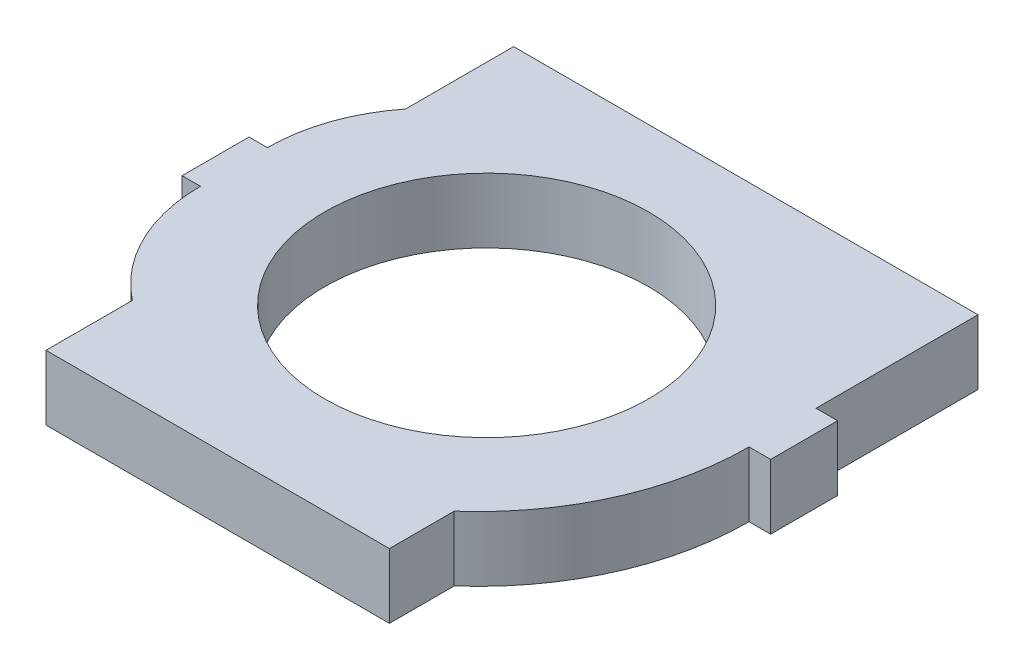
ISO-10303-21;
HEADER;
FILE_DESCRIPTION(('STEP AP214'),'2;1');
FILE_NAME('part.step','',(''),(''),'','','');
FILE_SCHEMA(('AUTOMOTIVE_DESIGN { 1 0 10303 214 1 1 1 1 }'));
ENDSEC;
DATA;
#1=APPLICATION_CONTEXT('core data for automotive mechanical design processes');
#2=APPLICATION_PROTOCOL_DEFINITION('international standard','automotive_design',2000,#1);
#3=PRODUCT_CONTEXT('',#1,'mechanical');
#4=PRODUCT('Part','Part','',(#3));
#5=PRODUCT_RELATED_PRODUCT_CATEGORY('part','',(#4));
#6=PRODUCT_DEFINITION_FORMATION('','',#4);
#7=PRODUCT_DEFINITION_CONTEXT('part definition',#1,'design');
#8=PRODUCT_DEFINITION('design','',#6,#7);
#9=PRODUCT_DEFINITION_SHAPE('','',#8);
#10=(LENGTH_UNIT() NAMED_UNIT(*) SI_UNIT(.MILLI.,.METRE.));
#11=(NAMED_UNIT(*) PLANE_ANGLE_UNIT() SI_UNIT($,.RADIAN.));
#12=(NAMED_UNIT(*) SI_UNIT($,.STERADIAN.) SOLID_ANGLE_UNIT());
#13=UNCERTAINTY_MEASURE_WITH_UNIT(LENGTH_MEASURE(1.E-05),#10,'distance_accuracy_value','');
#14=(GEOMETRIC_REPRESENTATION_CONTEXT(3) GLOBAL_UNCERTAINTY_ASSIGNED_CONTEXT((#13)) GLOBAL_UNIT_ASSIGNED_CONTEXT((#10,
#11,#12)) REPRESENTATION_CONTEXT('',''));
#15=CARTESIAN_POINT('',(0.,0.,0.));
#16=DIRECTION('',(0.,0.,1.));
#17=DIRECTION('',(1.,0.,0.));
#18=AXIS2_PLACEMENT_3D('',#15,#16,#17);
#19=CARTESIAN_POINT('',(0.,6.,0.));
#20=DIRECTION('',(0.,1.,0.));
#21=DIRECTION('',(0.,0.,1.));
#22=AXIS2_PLACEMENT_3D('',#19,#20,#21);
#23=PLANE('',#22);
#24=DIRECTION('',(0.,0.,1.));
#25=VECTOR('',#24,1.);
#26=CARTESIAN_POINT('',(24.9,6.,-6.2));
#27=LINE('',#26,#25);
#28=CARTESIAN_POINT('',(24.9,6.,-6.2));
#29=VERTEX_POINT('',#28);
#30=CARTESIAN_POINT('',(24.9,6.,0.));
#31=VERTEX_POINT('',#30);
#32=EDGE_CURVE('E50',#29,#31,#27,.T.);
#33=ORIENTED_EDGE('',*,*,#32,.F.);
#34=DIRECTION('',(1.,0.,0.));
#35=VECTOR('',#34,1.);
#36=CARTESIAN_POINT('',(22.9,6.,-6.2));
#37=LINE('',#36,#35);
#38=CARTESIAN_POINT('',(22.9,6.,-6.2));
#39=VERTEX_POINT('',#38);
#40=EDGE_CURVE('E156',#39,#29,#37,.T.);
#41=ORIENTED_EDGE('',*,*,#40,.F.);
#42=DIRECTION('',(0.,0.,1.));
#43=VECTOR('',#42,1.);
#44=CARTESIAN_POINT('',(22.9,6.,-21.2));
#45=LINE('',#44,#43);
#46=CARTESIAN_POINT('',(22.9,6.,-21.2));
#47=VERTEX_POINT('',#46);
#48=EDGE_CURVE('E169',#47,#39,#45,.T.);
#49=ORIENTED_EDGE('',*,*,#48,.F.);
#50=DIRECTION('',(-1.,0.,0.));
#51=VECTOR('',#50,1.);
#52=CARTESIAN_POINT('',(-31.4,6.,-21.2));
#53=LINE('',#52,#51);
#54=CARTESIAN_POINT('',(-20.1,6.,-21.2));
#55=VERTEX_POINT('',#54);
#56=EDGE_CURVE('E11',#47,#55,#53,.T.);
#57=ORIENTED_EDGE('',*,*,#56,.T.);
#58=DIRECTION('',(0.,0.,-1.));
#59=VECTOR('',#58,1.);
#60=CARTESIAN_POINT('',(-20.1,6.,-21.2));
#61=LINE('',#60,#59);
#62=CARTESIAN_POINT('',(-20.1,6.,-11.2));
#63=VERTEX_POINT('',#62);
#64=EDGE_CURVE('E215',#63,#55,#61,.T.);
#65=ORIENTED_EDGE('',*,*,#64,.F.);
#66=CARTESIAN_POINT('',(-8.07575757575762,6.,-1.69999999999999));
#67=DIRECTION('',(0.,-1.,0.));
#68=DIRECTION('',(0.,0.,-1.));
#69=AXIS2_PLACEMENT_3D('',#66,#67,#68);
#70=CIRCLE('',#69,15.3242424242424);
#71=CARTESIAN_POINT('',(-23.4,6.,-1.69999999999999));
#72=VERTEX_POINT('',#71);
#73=EDGE_CURVE('E212',#72,#63,#70,.T.);
#74=ORIENTED_EDGE('',*,*,#73,.F.);
#75=DIRECTION('',(1.,0.,0.));
#76=VECTOR('',#75,1.);
#77=CARTESIAN_POINT('',(-31.4,6.,-1.69999999999999));
#78=LINE('',#77,#76);
#79=CARTESIAN_POINT('',(-25.1,6.,-1.69999999999999));
#80=VERTEX_POINT('',#79);
#81=EDGE_CURVE('E210',#80,#72,#78,.T.);
#82=ORIENTED_EDGE('',*,*,#81,.F.);
#83=DIRECTION('',(0.,0.,-1.));
#84=VECTOR('',#83,1.);
#85=CARTESIAN_POINT('',(-25.1,6.,-1.69999999999999));
#86=LINE('',#85,#84);
#87=CARTESIAN_POINT('',(-25.1,6.,4.50000000000001));
#88=VERTEX_POINT('',#87);
#89=EDGE_CURVE('E292',#88,#80,#86,.T.);
#90=ORIENTED_EDGE('',*,*,#89,.F.);
#91=DIRECTION('',(-1.,0.,0.));
#92=VECTOR('',#91,1.);
#93=CARTESIAN_POINT('',(-23.4,6.,4.50000000000001));
#94=LINE('',#93,#92);
#95=CARTESIAN_POINT('',(-23.4,6.,4.50000000000001));
#96=VERTEX_POINT('',#95);
#97=EDGE_CURVE('E272',#96,#88,#94,.T.);
#98=ORIENTED_EDGE('',*,*,#97,.F.);
#99=CARTESIAN_POINT('',(-7.79250000000007,6.,4.50000000000001));
#100=DIRECTION('',(0.,-1.,0.));
#101=DIRECTION('',(0.,0.,-1.));
#102=AXIS2_PLACEMENT_3D('',#99,#100,#101);
#103=CIRCLE('',#102,15.6074999999999);
#104=CARTESIAN_POINT('',(-17.4,6.,16.8));
#105=VERTEX_POINT('',#104);
#106=EDGE_CURVE('E269',#105,#96,#103,.T.);
#107=ORIENTED_EDGE('',*,*,#106,.F.);
#108=DIRECTION('',(0.,0.,-1.));
#109=VECTOR('',#108,1.);
#110=CARTESIAN_POINT('',(-17.4,6.,24.8));
#111=LINE('',#110,#109);
#112=CARTESIAN_POINT('',(-17.4,6.,24.8));
#113=VERTEX_POINT('',#112);
#114=EDGE_CURVE('E218',#113,#105,#111,.T.);
#115=ORIENTED_EDGE('',*,*,#114,.F.);
#116=DIRECTION('',(1.,0.,0.));
#117=VECTOR('',#116,1.);
#118=CARTESIAN_POINT('',(-31.4,6.,24.8));
#119=LINE('',#118,#117);
#120=CARTESIAN_POINT('',(14.4,6.,24.8));
#121=VERTEX_POINT('',#120);
#122=EDGE_CURVE('E42',#113,#121,#119,.T.);
#123=ORIENTED_EDGE('',*,*,#122,.T.);
#124=DIRECTION('',(0.,0.,1.));
#125=VECTOR('',#124,1.);
#126=CARTESIAN_POINT('',(14.4,6.,18.8));
#127=LINE('',#126,#125);
#128=CARTESIAN_POINT('',(14.4,6.,18.8));
#129=VERTEX_POINT('',#128);
#130=EDGE_CURVE('E264',#129,#121,#127,.T.);
#131=ORIENTED_EDGE('',*,*,#130,.F.);
#132=CARTESIAN_POINT('',(-2.14058823529411,6.,0.));
#133=DIRECTION('',(0.,-1.,0.));
#134=DIRECTION('',(0.,0.,-1.));
#135=AXIS2_PLACEMENT_3D('',#132,#133,#134);
#136=CIRCLE('',#135,25.0405882352941);
#137=CARTESIAN_POINT('',(22.9,6.,0.));
#138=VERTEX_POINT('',#137);
#139=EDGE_CURVE('E313',#138,#129,#136,.T.);
#140=ORIENTED_EDGE('',*,*,#139,.F.);
#141=DIRECTION('',(-1.,0.,0.));
#142=VECTOR('',#141,1.);
#143=CARTESIAN_POINT('',(31.4,6.,0.));
#144=LINE('',#143,#142);
#145=EDGE_CURVE('E317',#31,#138,#144,.T.);
#146=ORIENTED_EDGE('',*,*,#145,.F.);
#147=EDGE_LOOP('',(#33,#41,#49,#57,#65,#74,#82,#90,#98,#107,#115,#123,#131,#140,#146));
#148=FACE_BOUND('',#147,.T.);
#149=CARTESIAN_POINT('',(-0.599999999999993,6.,0.800000000000006));
#150=DIRECTION('',(0.,1.,0.));
#151=DIRECTION('',(0.,0.,1.));
#152=AXIS2_PLACEMENT_3D('',#149,#150,#151);
#153=CIRCLE('',#152,15.);
#154=CARTESIAN_POINT('',(-0.599999999999993,6.,15.8));
#155=VERTEX_POINT('',#154);
#156=EDGE_CURVE('E176',#155,#155,#153,.T.);
#157=ORIENTED_EDGE('',*,*,#156,.F.);
#158=EDGE_LOOP('',(#157));
#159=FACE_BOUND('',#158,.T.);
#160=ADVANCED_FACE('F33',(#148,#159),#23,.T.);
#161=CARTESIAN_POINT('',(0.,0.,0.));
#162=DIRECTION('',(0.,1.,0.));
#163=DIRECTION('',(0.,0.,1.));
#164=AXIS2_PLACEMENT_3D('',#161,#162,#163);
#165=PLANE('',#164);
#166=DIRECTION('',(1.,0.,0.));
#167=VECTOR('',#166,1.);
#168=CARTESIAN_POINT('',(22.9,0.,-6.2));
#169=LINE('',#168,#167);
#170=CARTESIAN_POINT('',(22.9,0.,-6.2));
#171=VERTEX_POINT('',#170);
#172=CARTESIAN_POINT('',(24.9,0.,-6.2));
#173=VERTEX_POINT('',#172);
#174=EDGE_CURVE('E153',#171,#173,#169,.T.);
#175=ORIENTED_EDGE('',*,*,#174,.T.);
#176=DIRECTION('',(0.,0.,1.));
#177=VECTOR('',#176,1.);
#178=CARTESIAN_POINT('',(24.9,0.,-6.2));
#179=LINE('',#178,#177);
#180=CARTESIAN_POINT('',(24.9,0.,0.));
#181=VERTEX_POINT('',#180);
#182=EDGE_CURVE('E140',#173,#181,#179,.T.);
#183=ORIENTED_EDGE('',*,*,#182,.T.);
#184=DIRECTION('',(-1.,0.,0.));
#185=VECTOR('',#184,1.);
#186=CARTESIAN_POINT('',(31.4,0.,0.));
#187=LINE('',#186,#185);
#188=CARTESIAN_POINT('',(22.9,0.,0.));
#189=VERTEX_POINT('',#188);
#190=EDGE_CURVE('E322',#181,#189,#187,.T.);
#191=ORIENTED_EDGE('',*,*,#190,.T.);
#192=CARTESIAN_POINT('',(-2.14058823529411,0.,0.));
#193=DIRECTION('',(0.,-1.,0.));
#194=DIRECTION('',(0.,0.,-1.));
#195=AXIS2_PLACEMENT_3D('',#192,#193,#194);
#196=CIRCLE('',#195,25.0405882352941);
#197=CARTESIAN_POINT('',(14.4,0.,18.8));
#198=VERTEX_POINT('',#197);
#199=EDGE_CURVE('E309',#189,#198,#196,.T.);
#200=ORIENTED_EDGE('',*,*,#199,.T.);
#201=DIRECTION('',(0.,0.,1.));
#202=VECTOR('',#201,1.);
#203=CARTESIAN_POINT('',(14.4,0.,18.8));
#204=LINE('',#203,#202);
#205=CARTESIAN_POINT('',(14.4,0.,24.8));
#206=VERTEX_POINT('',#205);
#207=EDGE_CURVE('E316',#198,#206,#204,.T.);
#208=ORIENTED_EDGE('',*,*,#207,.T.);
#209=DIRECTION('',(1.,0.,0.));
#210=VECTOR('',#209,1.);
#211=CARTESIAN_POINT('',(-31.4,0.,24.8));
#212=LINE('',#211,#210);
#213=CARTESIAN_POINT('',(-17.4,0.,24.8));
#214=VERTEX_POINT('',#213);
#215=EDGE_CURVE('E179',#214,#206,#212,.T.);
#216=ORIENTED_EDGE('',*,*,#215,.F.);
#217=DIRECTION('',(0.,0.,-1.));
#218=VECTOR('',#217,1.);
#219=CARTESIAN_POINT('',(-17.4,0.,24.8));
#220=LINE('',#219,#218);
#221=CARTESIAN_POINT('',(-17.4,0.,16.8));
#222=VERTEX_POINT('',#221);
#223=EDGE_CURVE('E280',#214,#222,#220,.T.);
#224=ORIENTED_EDGE('',*,*,#223,.T.);
#225=CARTESIAN_POINT('',(-7.79250000000007,0.,4.50000000000001));
#226=DIRECTION('',(0.,-1.,0.));
#227=DIRECTION('',(0.,0.,-1.));
#228=AXIS2_PLACEMENT_3D('',#225,#226,#227);
#229=CIRCLE('',#228,15.6074999999999);
#230=CARTESIAN_POINT('',(-23.4,0.,4.50000000000001));
#231=VERTEX_POINT('',#230);
#232=EDGE_CURVE('E302',#222,#231,#229,.T.);
#233=ORIENTED_EDGE('',*,*,#232,.T.);
#234=DIRECTION('',(-1.,0.,0.));
#235=VECTOR('',#234,1.);
#236=CARTESIAN_POINT('',(-23.4,0.,4.50000000000001));
#237=LINE('',#236,#235);
#238=CARTESIAN_POINT('',(-25.1,0.,4.50000000000001));
#239=VERTEX_POINT('',#238);
#240=EDGE_CURVE('E275',#231,#239,#237,.T.);
#241=ORIENTED_EDGE('',*,*,#240,.T.);
#242=DIRECTION('',(0.,0.,-1.));
#243=VECTOR('',#242,1.);
#244=CARTESIAN_POINT('',(-25.1,0.,-1.69999999999999));
#245=LINE('',#244,#243);
#246=CARTESIAN_POINT('',(-25.1,0.,-1.69999999999999));
#247=VERTEX_POINT('',#246);
#248=EDGE_CURVE('E58',#239,#247,#245,.T.);
#249=ORIENTED_EDGE('',*,*,#248,.T.);
#250=DIRECTION('',(1.,0.,0.));
#251=VECTOR('',#250,1.);
#252=CARTESIAN_POINT('',(-31.4,0.,-1.69999999999999));
#253=LINE('',#252,#251);
#254=CARTESIAN_POINT('',(-23.4,0.,-1.69999999999999));
#255=VERTEX_POINT('',#254);
#256=EDGE_CURVE('E206',#247,#255,#253,.T.);
#257=ORIENTED_EDGE('',*,*,#256,.T.);
#258=CARTESIAN_POINT('',(-8.07575757575762,0.,-1.69999999999999));
#259=DIRECTION('',(0.,-1.,0.));
#260=DIRECTION('',(0.,0.,-1.));
#261=AXIS2_PLACEMENT_3D('',#258,#259,#260);
#262=CIRCLE('',#261,15.3242424242424);
#263=CARTESIAN_POINT('',(-20.1,0.,-11.2));
#264=VERTEX_POINT('',#263);
#265=EDGE_CURVE('E200',#255,#264,#262,.T.);
#266=ORIENTED_EDGE('',*,*,#265,.T.);
#267=DIRECTION('',(0.,0.,-1.));
#268=VECTOR('',#267,1.);
#269=CARTESIAN_POINT('',(-20.1,0.,-21.2));
#270=LINE('',#269,#268);
#271=CARTESIAN_POINT('',(-20.1,0.,-21.2));
#272=VERTEX_POINT('',#271);
#273=EDGE_CURVE('E198',#264,#272,#270,.T.);
#274=ORIENTED_EDGE('',*,*,#273,.T.);
#275=DIRECTION('',(-1.,0.,0.));
#276=VECTOR('',#275,1.);
#277=CARTESIAN_POINT('',(-31.4,0.,-21.2));
#278=LINE('',#277,#276);
#279=CARTESIAN_POINT('',(22.9,0.,-21.2));
#280=VERTEX_POINT('',#279);
#281=EDGE_CURVE('E37',#280,#272,#278,.T.);
#282=ORIENTED_EDGE('',*,*,#281,.F.);
#283=DIRECTION('',(0.,0.,1.));
#284=VECTOR('',#283,1.);
#285=CARTESIAN_POINT('',(22.9,0.,-21.2));
#286=LINE('',#285,#284);
#287=EDGE_CURVE('E161',#280,#171,#286,.T.);
#288=ORIENTED_EDGE('',*,*,#287,.T.);
#289=EDGE_LOOP('',(#175,#183,#191,#200,#208,#216,#224,#233,#241,#249,#257,#266,#274,#282,#288));
#290=FACE_BOUND('',#289,.T.);
#291=CARTESIAN_POINT('',(-0.599999999999993,0.,0.800000000000006));
#292=DIRECTION('',(0.,1.,0.));
#293=DIRECTION('',(0.,0.,1.));
#294=AXIS2_PLACEMENT_3D('',#291,#292,#293);
#295=CIRCLE('',#294,15.);
#296=CARTESIAN_POINT('',(-0.599999999999993,0.,15.8));
#297=VERTEX_POINT('',#296);
#298=EDGE_CURVE('E174',#297,#297,#295,.T.);
#299=ORIENTED_EDGE('',*,*,#298,.T.);
#300=EDGE_LOOP('',(#299));
#301=FACE_BOUND('',#300,.T.);
#302=ADVANCED_FACE('F158',(#290,#301),#165,.F.);
#303=CARTESIAN_POINT('',(-31.4,6.,24.8));
#304=DIRECTION('',(0.,0.,-1.));
#305=DIRECTION('',(-1.,0.,0.));
#306=AXIS2_PLACEMENT_3D('',#303,#304,#305);
#307=PLANE('',#306);
#308=ORIENTED_EDGE('',*,*,#122,.F.);
#309=DIRECTION('',(0.,1.,0.));
#310=VECTOR('',#309,1.);
#311=CARTESIAN_POINT('',(-17.4,0.,24.8));
#312=LINE('',#311,#310);
#313=EDGE_CURVE('E259',#214,#113,#312,.T.);
#314=ORIENTED_EDGE('',*,*,#313,.F.);
#315=ORIENTED_EDGE('',*,*,#215,.T.);
#316=DIRECTION('',(0.,1.,0.));
#317=VECTOR('',#316,1.);
#318=CARTESIAN_POINT('',(14.4,0.,24.8));
#319=LINE('',#318,#317);
#320=EDGE_CURVE('E260',#206,#121,#319,.T.);
#321=ORIENTED_EDGE('',*,*,#320,.T.);
#322=EDGE_LOOP('',(#308,#314,#315,#321));
#323=FACE_BOUND('',#322,.T.);
#324=ADVANCED_FACE('F35',(#323),#307,.F.);
#325=CARTESIAN_POINT('',(-31.4,6.,-21.2));
#326=DIRECTION('',(0.,0.,1.));
#327=DIRECTION('',(1.,0.,0.));
#328=AXIS2_PLACEMENT_3D('',#325,#326,#327);
#329=PLANE('',#328);
#330=ORIENTED_EDGE('',*,*,#281,.T.);
#331=DIRECTION('',(0.,1.,0.));
#332=VECTOR('',#331,1.);
#333=CARTESIAN_POINT('',(-20.1,0.,-21.2));
#334=LINE('',#333,#332);
#335=EDGE_CURVE('E194',#272,#55,#334,.T.);
#336=ORIENTED_EDGE('',*,*,#335,.T.);
#337=ORIENTED_EDGE('',*,*,#56,.F.);
#338=DIRECTION('',(0.,1.,0.));
#339=VECTOR('',#338,1.);
#340=CARTESIAN_POINT('',(22.9,0.,-21.2));
#341=LINE('',#340,#339);
#342=EDGE_CURVE('E162',#280,#47,#341,.T.);
#343=ORIENTED_EDGE('',*,*,#342,.F.);
#344=EDGE_LOOP('',(#330,#336,#337,#343));
#345=FACE_BOUND('',#344,.T.);
#346=ADVANCED_FACE('F192',(#345),#329,.F.);
#347=CARTESIAN_POINT('',(-0.599999999999993,6.,0.800000000000006));
#348=DIRECTION('',(0.,-1.,0.));
#349=DIRECTION('',(0.,0.,-1.));
#350=AXIS2_PLACEMENT_3D('',#347,#348,#349);
#351=CYLINDRICAL_SURFACE('',#350,15.);
#352=ORIENTED_EDGE('',*,*,#156,.T.);
#353=EDGE_LOOP('',(#352));
#354=FACE_BOUND('',#353,.T.);
#355=ORIENTED_EDGE('',*,*,#298,.F.);
#356=EDGE_LOOP('',(#355));
#357=FACE_BOUND('',#356,.T.);
#358=ADVANCED_FACE('F239',(#354,#357),#351,.F.);
#359=CARTESIAN_POINT('',(22.9,0.,-6.2));
#360=DIRECTION('',(0.,0.,1.));
#361=DIRECTION('',(1.,0.,0.));
#362=AXIS2_PLACEMENT_3D('',#359,#360,#361);
#363=PLANE('',#362);
#364=ORIENTED_EDGE('',*,*,#40,.T.);
#365=DIRECTION('',(0.,1.,0.));
#366=VECTOR('',#365,1.);
#367=CARTESIAN_POINT('',(24.9,0.,-6.2));
#368=LINE('',#367,#366);
#369=EDGE_CURVE('E143',#173,#29,#368,.T.);
#370=ORIENTED_EDGE('',*,*,#369,.F.);
#371=ORIENTED_EDGE('',*,*,#174,.F.);
#372=DIRECTION('',(0.,1.,0.));
#373=VECTOR('',#372,1.);
#374=CARTESIAN_POINT('',(22.9,0.,-6.2));
#375=LINE('',#374,#373);
#376=EDGE_CURVE('E164',#171,#39,#375,.T.);
#377=ORIENTED_EDGE('',*,*,#376,.T.);
#378=EDGE_LOOP('',(#364,#370,#371,#377));
#379=FACE_BOUND('',#378,.T.);
#380=ADVANCED_FACE('F152',(#379),#363,.F.);
#381=CARTESIAN_POINT('',(22.9,0.,-21.2));
#382=DIRECTION('',(-1.,0.,0.));
#383=DIRECTION('',(0.,0.,1.));
#384=AXIS2_PLACEMENT_3D('',#381,#382,#383);
#385=PLANE('',#384);
#386=ORIENTED_EDGE('',*,*,#48,.T.);
#387=ORIENTED_EDGE('',*,*,#376,.F.);
#388=ORIENTED_EDGE('',*,*,#287,.F.);
#389=ORIENTED_EDGE('',*,*,#342,.T.);
#390=EDGE_LOOP('',(#386,#387,#388,#389));
#391=FACE_BOUND('',#390,.T.);
#392=ADVANCED_FACE('F230',(#391),#385,.F.);
#393=CARTESIAN_POINT('',(-20.1,0.,-21.2));
#394=DIRECTION('',(1.,0.,0.));
#395=DIRECTION('',(0.,0.,-1.));
#396=AXIS2_PLACEMENT_3D('',#393,#394,#395);
#397=PLANE('',#396);
#398=ORIENTED_EDGE('',*,*,#64,.T.);
#399=ORIENTED_EDGE('',*,*,#335,.F.);
#400=ORIENTED_EDGE('',*,*,#273,.F.);
#401=DIRECTION('',(0.,1.,0.));
#402=VECTOR('',#401,1.);
#403=CARTESIAN_POINT('',(-20.1,0.,-11.2));
#404=LINE('',#403,#402);
#405=EDGE_CURVE('E205',#264,#63,#404,.T.);
#406=ORIENTED_EDGE('',*,*,#405,.T.);
#407=EDGE_LOOP('',(#398,#399,#400,#406));
#408=FACE_BOUND('',#407,.T.);
#409=ADVANCED_FACE('F219',(#408),#397,.F.);
#410=CARTESIAN_POINT('',(-8.07575757575762,0.,-1.69999999999999));
#411=DIRECTION('',(0.,1.,0.));
#412=DIRECTION('',(0.,0.,1.));
#413=AXIS2_PLACEMENT_3D('',#410,#411,#412);
#414=CYLINDRICAL_SURFACE('',#413,15.3242424242424);
#415=ORIENTED_EDGE('',*,*,#73,.T.);
#416=ORIENTED_EDGE('',*,*,#405,.F.);
#417=ORIENTED_EDGE('',*,*,#265,.F.);
#418=DIRECTION('',(0.,1.,0.));
#419=VECTOR('',#418,1.);
#420=CARTESIAN_POINT('',(-23.4,0.,-1.69999999999999));
#421=LINE('',#420,#419);
#422=EDGE_CURVE('E202',#255,#72,#421,.T.);
#423=ORIENTED_EDGE('',*,*,#422,.T.);
#424=EDGE_LOOP('',(#415,#416,#417,#423));
#425=FACE_BOUND('',#424,.T.);
#426=ADVANCED_FACE('F223',(#425),#414,.T.);
#427=CARTESIAN_POINT('',(-31.4,0.,-1.69999999999999));
#428=DIRECTION('',(0.,0.,1.));
#429=DIRECTION('',(1.,0.,0.));
#430=AXIS2_PLACEMENT_3D('',#427,#428,#429);
#431=PLANE('',#430);
#432=ORIENTED_EDGE('',*,*,#256,.F.);
#433=DIRECTION('',(0.,1.,0.));
#434=VECTOR('',#433,1.);
#435=CARTESIAN_POINT('',(-25.1,0.,-1.69999999999999));
#436=LINE('',#435,#434);
#437=EDGE_CURVE('E290',#247,#80,#436,.T.);
#438=ORIENTED_EDGE('',*,*,#437,.T.);
#439=ORIENTED_EDGE('',*,*,#81,.T.);
#440=ORIENTED_EDGE('',*,*,#422,.F.);
#441=EDGE_LOOP('',(#432,#438,#439,#440));
#442=FACE_BOUND('',#441,.T.);
#443=ADVANCED_FACE('F289',(#442),#431,.F.);
#444=CARTESIAN_POINT('',(14.4,0.,18.8));
#445=DIRECTION('',(-1.,0.,0.));
#446=DIRECTION('',(0.,0.,1.));
#447=AXIS2_PLACEMENT_3D('',#444,#445,#446);
#448=PLANE('',#447);
#449=ORIENTED_EDGE('',*,*,#130,.T.);
#450=ORIENTED_EDGE('',*,*,#320,.F.);
#451=ORIENTED_EDGE('',*,*,#207,.F.);
#452=DIRECTION('',(0.,1.,0.));
#453=VECTOR('',#452,1.);
#454=CARTESIAN_POINT('',(14.4,0.,18.8));
#455=LINE('',#454,#453);
#456=EDGE_CURVE('E172',#198,#129,#455,.T.);
#457=ORIENTED_EDGE('',*,*,#456,.T.);
#458=EDGE_LOOP('',(#449,#450,#451,#457));
#459=FACE_BOUND('',#458,.T.);
#460=ADVANCED_FACE('F339',(#459),#448,.F.);
#461=CARTESIAN_POINT('',(-2.14058823529411,0.,0.));
#462=DIRECTION('',(0.,1.,0.));
#463=DIRECTION('',(0.,0.,1.));
#464=AXIS2_PLACEMENT_3D('',#461,#462,#463);
#465=CYLINDRICAL_SURFACE('',#464,25.0405882352941);
#466=ORIENTED_EDGE('',*,*,#139,.T.);
#467=ORIENTED_EDGE('',*,*,#456,.F.);
#468=ORIENTED_EDGE('',*,*,#199,.F.);
#469=DIRECTION('',(0.,1.,0.));
#470=VECTOR('',#469,1.);
#471=CARTESIAN_POINT('',(22.9,0.,0.));
#472=LINE('',#471,#470);
#473=EDGE_CURVE('E308',#189,#138,#472,.T.);
#474=ORIENTED_EDGE('',*,*,#473,.T.);
#475=EDGE_LOOP('',(#466,#467,#468,#474));
#476=FACE_BOUND('',#475,.T.);
#477=ADVANCED_FACE('F335',(#476),#465,.T.);
#478=CARTESIAN_POINT('',(31.4,0.,0.));
#479=DIRECTION('',(0.,0.,-1.));
#480=DIRECTION('',(-1.,0.,0.));
#481=AXIS2_PLACEMENT_3D('',#478,#479,#480);
#482=PLANE('',#481);
#483=ORIENTED_EDGE('',*,*,#190,.F.);
#484=DIRECTION('',(0.,1.,0.));
#485=VECTOR('',#484,1.);
#486=CARTESIAN_POINT('',(24.9,0.,0.));
#487=LINE('',#486,#485);
#488=EDGE_CURVE('E144',#181,#31,#487,.T.);
#489=ORIENTED_EDGE('',*,*,#488,.T.);
#490=ORIENTED_EDGE('',*,*,#145,.T.);
#491=ORIENTED_EDGE('',*,*,#473,.F.);
#492=EDGE_LOOP('',(#483,#489,#490,#491));
#493=FACE_BOUND('',#492,.T.);
#494=ADVANCED_FACE('F332',(#493),#482,.F.);
#495=CARTESIAN_POINT('',(-23.4,0.,4.50000000000001));
#496=DIRECTION('',(0.,0.,-1.));
#497=DIRECTION('',(-1.,0.,0.));
#498=AXIS2_PLACEMENT_3D('',#495,#496,#497);
#499=PLANE('',#498);
#500=ORIENTED_EDGE('',*,*,#97,.T.);
#501=DIRECTION('',(0.,1.,0.));
#502=VECTOR('',#501,1.);
#503=CARTESIAN_POINT('',(-25.1,0.,4.50000000000001));
#504=LINE('',#503,#502);
#505=EDGE_CURVE('E297',#239,#88,#504,.T.);
#506=ORIENTED_EDGE('',*,*,#505,.F.);
#507=ORIENTED_EDGE('',*,*,#240,.F.);
#508=DIRECTION('',(0.,1.,0.));
#509=VECTOR('',#508,1.);
#510=CARTESIAN_POINT('',(-23.4,0.,4.50000000000001));
#511=LINE('',#510,#509);
#512=EDGE_CURVE('E281',#231,#96,#511,.T.);
#513=ORIENTED_EDGE('',*,*,#512,.T.);
#514=EDGE_LOOP('',(#500,#506,#507,#513));
#515=FACE_BOUND('',#514,.T.);
#516=ADVANCED_FACE('F295',(#515),#499,.F.);
#517=CARTESIAN_POINT('',(-7.79250000000007,0.,4.50000000000001));
#518=DIRECTION('',(0.,1.,0.));
#519=DIRECTION('',(0.,0.,1.));
#520=AXIS2_PLACEMENT_3D('',#517,#518,#519);
#521=CYLINDRICAL_SURFACE('',#520,15.6074999999999);
#522=ORIENTED_EDGE('',*,*,#106,.T.);
#523=ORIENTED_EDGE('',*,*,#512,.F.);
#524=ORIENTED_EDGE('',*,*,#232,.F.);
#525=DIRECTION('',(0.,1.,0.));
#526=VECTOR('',#525,1.);
#527=CARTESIAN_POINT('',(-17.4,0.,16.8));
#528=LINE('',#527,#526);
#529=EDGE_CURVE('E283',#222,#105,#528,.T.);
#530=ORIENTED_EDGE('',*,*,#529,.T.);
#531=EDGE_LOOP('',(#522,#523,#524,#530));
#532=FACE_BOUND('',#531,.T.);
#533=ADVANCED_FACE('F301',(#532),#521,.T.);
#534=CARTESIAN_POINT('',(-17.4,0.,24.8));
#535=DIRECTION('',(1.,0.,0.));
#536=DIRECTION('',(0.,0.,-1.));
#537=AXIS2_PLACEMENT_3D('',#534,#535,#536);
#538=PLANE('',#537);
#539=ORIENTED_EDGE('',*,*,#114,.T.);
#540=ORIENTED_EDGE('',*,*,#529,.F.);
#541=ORIENTED_EDGE('',*,*,#223,.F.);
#542=ORIENTED_EDGE('',*,*,#313,.T.);
#543=EDGE_LOOP('',(#539,#540,#541,#542));
#544=FACE_BOUND('',#543,.T.);
#545=ADVANCED_FACE('F304',(#544),#538,.F.);
#546=CARTESIAN_POINT('',(-25.1,0.,-1.69999999999999));
#547=DIRECTION('',(1.,0.,0.));
#548=DIRECTION('',(0.,0.,-1.));
#549=AXIS2_PLACEMENT_3D('',#546,#547,#548);
#550=PLANE('',#549);
#551=ORIENTED_EDGE('',*,*,#89,.T.);
#552=ORIENTED_EDGE('',*,*,#437,.F.);
#553=ORIENTED_EDGE('',*,*,#248,.F.);
#554=ORIENTED_EDGE('',*,*,#505,.T.);
#555=EDGE_LOOP('',(#551,#552,#553,#554));
#556=FACE_BOUND('',#555,.T.);
#557=ADVANCED_FACE('F356',(#556),#550,.F.);
#558=CARTESIAN_POINT('',(24.9,0.,-6.2));
#559=DIRECTION('',(-1.,0.,0.));
#560=DIRECTION('',(0.,0.,1.));
#561=AXIS2_PLACEMENT_3D('',#558,#559,#560);
#562=PLANE('',#561);
#563=ORIENTED_EDGE('',*,*,#32,.T.);
#564=ORIENTED_EDGE('',*,*,#488,.F.);
#565=ORIENTED_EDGE('',*,*,#182,.F.);
#566=ORIENTED_EDGE('',*,*,#369,.T.);
#567=EDGE_LOOP('',(#563,#564,#565,#566));
#568=FACE_BOUND('',#567,.T.);
#569=ADVANCED_FACE('F142',(#568),#562,.F.);
#570=CLOSED_SHELL('',(#160,#302,#324,#346,#358,#380,#392,#409,#426,#443,#460,#477,#494,#516,
#533,#545,#557,#569));
#571=MANIFOLD_SOLID_BREP('B2',#570);
#572=ADVANCED_BREP_SHAPE_REPRESENTATION('',(#18,#571),#14);
#573=SHAPE_DEFINITION_REPRESENTATION(#9,#572);
ENDSEC;
END-ISO-10303-21;
